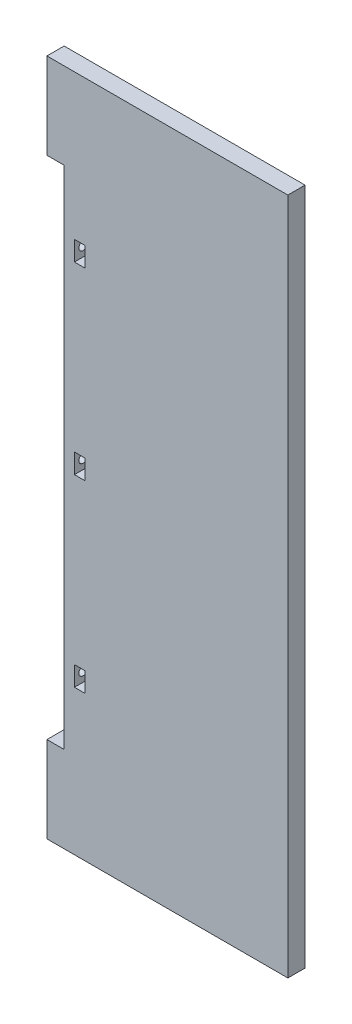
ISO-10303-21;
HEADER;
FILE_DESCRIPTION(('STEP AP214'),'2;1');
FILE_NAME('part.step','',(''),(''),'','','');
FILE_SCHEMA(('AUTOMOTIVE_DESIGN { 1 0 10303 214 1 1 1 1 }'));
ENDSEC;
DATA;
#1=APPLICATION_CONTEXT('core data for automotive mechanical design processes');
#2=APPLICATION_PROTOCOL_DEFINITION('international standard','automotive_design',2000,#1);
#3=PRODUCT_CONTEXT('',#1,'mechanical');
#4=PRODUCT('Part','Part','',(#3));
#5=PRODUCT_RELATED_PRODUCT_CATEGORY('part','',(#4));
#6=PRODUCT_DEFINITION_FORMATION('','',#4);
#7=PRODUCT_DEFINITION_CONTEXT('part definition',#1,'design');
#8=PRODUCT_DEFINITION('design','',#6,#7);
#9=PRODUCT_DEFINITION_SHAPE('','',#8);
#10=(LENGTH_UNIT() NAMED_UNIT(*) SI_UNIT(.MILLI.,.METRE.));
#11=(NAMED_UNIT(*) PLANE_ANGLE_UNIT() SI_UNIT($,.RADIAN.));
#12=(NAMED_UNIT(*) SI_UNIT($,.STERADIAN.) SOLID_ANGLE_UNIT());
#13=UNCERTAINTY_MEASURE_WITH_UNIT(LENGTH_MEASURE(1.E-05),#10,'distance_accuracy_value','');
#14=(GEOMETRIC_REPRESENTATION_CONTEXT(3) GLOBAL_UNCERTAINTY_ASSIGNED_CONTEXT((#13)) GLOBAL_UNIT_ASSIGNED_CONTEXT((#10,
#11,#12)) REPRESENTATION_CONTEXT('',''));
#15=CARTESIAN_POINT('',(0.,0.,0.));
#16=DIRECTION('',(0.,0.,1.));
#17=DIRECTION('',(1.,0.,0.));
#18=AXIS2_PLACEMENT_3D('',#15,#16,#17);
#19=CARTESIAN_POINT('',(-58.9999999999997,149.15,-0.50000000000026));
#20=DIRECTION('',(0.,-1.,0.));
#21=DIRECTION('',(1.,0.,0.));
#22=AXIS2_PLACEMENT_3D('',#19,#20,#21);
#23=PLANE('',#22);
#24=DIRECTION('',(1.,0.,0.));
#25=VECTOR('',#24,1.);
#26=CARTESIAN_POINT('',(-46.6231617647057,149.15,-5.50000000000026));
#27=LINE('',#26,#25);
#28=CARTESIAN_POINT('',(-61.9999999999998,149.15,-5.50000000000026));
#29=VERTEX_POINT('',#28);
#30=CARTESIAN_POINT('',(-58.9999999999997,149.15,-5.50000000000026));
#31=VERTEX_POINT('',#30);
#32=EDGE_CURVE('E157',#29,#31,#27,.T.);
#33=ORIENTED_EDGE('',*,*,#32,.F.);
#34=DIRECTION('',(0.,0.,-1.));
#35=VECTOR('',#34,1.);
#36=CARTESIAN_POINT('',(-61.9999999999998,149.15,-0.50000000000026));
#37=LINE('',#36,#35);
#38=CARTESIAN_POINT('',(-61.9999999999998,149.15,-0.50000000000026));
#39=VERTEX_POINT('',#38);
#40=EDGE_CURVE('E159',#39,#29,#37,.T.);
#41=ORIENTED_EDGE('',*,*,#40,.F.);
#42=DIRECTION('',(-1.,0.,0.));
#43=VECTOR('',#42,1.);
#44=CARTESIAN_POINT('',(-46.6231617647057,149.15,-0.50000000000026));
#45=LINE('',#44,#43);
#46=CARTESIAN_POINT('',(-58.9999999999997,149.15,-0.50000000000026));
#47=VERTEX_POINT('',#46);
#48=EDGE_CURVE('E189',#47,#39,#45,.T.);
#49=ORIENTED_EDGE('',*,*,#48,.F.);
#50=DIRECTION('',(0.,0.,-1.));
#51=VECTOR('',#50,1.);
#52=CARTESIAN_POINT('',(-58.9999999999997,149.15,-0.50000000000026));
#53=LINE('',#52,#51);
#54=EDGE_CURVE('E11',#47,#31,#53,.T.);
#55=ORIENTED_EDGE('',*,*,#54,.T.);
#56=EDGE_LOOP('',(#33,#41,#49,#55));
#57=FACE_BOUND('',#56,.T.);
#58=ADVANCED_FACE('F16',(#57),#23,.F.);
#59=CARTESIAN_POINT('',(-58.9999999999997,154.85,-0.50000000000026));
#60=DIRECTION('',(1.,0.,0.));
#61=DIRECTION('',(0.,1.,0.));
#62=AXIS2_PLACEMENT_3D('',#59,#60,#61);
#63=PLANE('',#62);
#64=DIRECTION('',(0.,1.,0.));
#65=VECTOR('',#64,1.);
#66=CARTESIAN_POINT('',(-58.9999999999997,126.675,-5.50000000000026));
#67=LINE('',#66,#65);
#68=CARTESIAN_POINT('',(-58.9999999999997,154.85,-5.50000000000026));
#69=VERTEX_POINT('',#68);
#70=EDGE_CURVE('E166',#31,#69,#67,.T.);
#71=ORIENTED_EDGE('',*,*,#70,.F.);
#72=ORIENTED_EDGE('',*,*,#54,.F.);
#73=DIRECTION('',(0.,-1.,0.));
#74=VECTOR('',#73,1.);
#75=CARTESIAN_POINT('',(-58.9999999999997,126.675,-0.50000000000026));
#76=LINE('',#75,#74);
#77=CARTESIAN_POINT('',(-58.9999999999997,154.85,-0.50000000000026));
#78=VERTEX_POINT('',#77);
#79=EDGE_CURVE('E573',#78,#47,#76,.T.);
#80=ORIENTED_EDGE('',*,*,#79,.F.);
#81=DIRECTION('',(0.,0.,-1.));
#82=VECTOR('',#81,1.);
#83=CARTESIAN_POINT('',(-58.9999999999997,154.85,-0.50000000000026));
#84=LINE('',#83,#82);
#85=EDGE_CURVE('E25',#78,#69,#84,.T.);
#86=ORIENTED_EDGE('',*,*,#85,.T.);
#87=EDGE_LOOP('',(#71,#72,#80,#86));
#88=FACE_BOUND('',#87,.T.);
#89=CARTESIAN_POINT('',(-58.9999999999997,152.,-3.00000000000026));
#90=DIRECTION('',(-1.,0.,0.));
#91=DIRECTION('',(0.,1.,0.));
#92=AXIS2_PLACEMENT_3D('',#89,#90,#91);
#93=CIRCLE('',#92,1.2295);
#94=CARTESIAN_POINT('',(-58.9999999999997,153.2295,-3.00000000000026));
#95=VERTEX_POINT('',#94);
#96=EDGE_CURVE('E221',#95,#95,#93,.T.);
#97=ORIENTED_EDGE('',*,*,#96,.F.);
#98=EDGE_LOOP('',(#97));
#99=FACE_BOUND('',#98,.T.);
#100=ADVANCED_FACE('F392',(#88,#99),#63,.F.);
#101=CARTESIAN_POINT('',(-61.9999999999998,154.85,-0.50000000000026));
#102=DIRECTION('',(0.,1.,0.));
#103=DIRECTION('',(-1.,0.,0.));
#104=AXIS2_PLACEMENT_3D('',#101,#102,#103);
#105=PLANE('',#104);
#106=DIRECTION('',(-1.,0.,0.));
#107=VECTOR('',#106,1.);
#108=CARTESIAN_POINT('',(-48.1231617647057,154.85,-5.50000000000026));
#109=LINE('',#108,#107);
#110=CARTESIAN_POINT('',(-61.9999999999998,154.85,-5.50000000000026));
#111=VERTEX_POINT('',#110);
#112=EDGE_CURVE('E180',#69,#111,#109,.T.);
#113=ORIENTED_EDGE('',*,*,#112,.F.);
#114=ORIENTED_EDGE('',*,*,#85,.F.);
#115=DIRECTION('',(1.,0.,0.));
#116=VECTOR('',#115,1.);
#117=CARTESIAN_POINT('',(-48.1231617647057,154.85,-0.50000000000026));
#118=LINE('',#117,#116);
#119=CARTESIAN_POINT('',(-61.9999999999998,154.85,-0.50000000000026));
#120=VERTEX_POINT('',#119);
#121=EDGE_CURVE('E351',#120,#78,#118,.T.);
#122=ORIENTED_EDGE('',*,*,#121,.F.);
#123=DIRECTION('',(0.,0.,-1.));
#124=VECTOR('',#123,1.);
#125=CARTESIAN_POINT('',(-61.9999999999998,154.85,-0.50000000000026));
#126=LINE('',#125,#124);
#127=EDGE_CURVE('E175',#120,#111,#126,.T.);
#128=ORIENTED_EDGE('',*,*,#127,.T.);
#129=EDGE_LOOP('',(#113,#114,#122,#128));
#130=FACE_BOUND('',#129,.T.);
#131=ADVANCED_FACE('F397',(#130),#105,.F.);
#132=CARTESIAN_POINT('',(-61.9999999999998,149.15,-0.50000000000026));
#133=DIRECTION('',(-1.,0.,0.));
#134=DIRECTION('',(0.,-1.,0.));
#135=AXIS2_PLACEMENT_3D('',#132,#133,#134);
#136=PLANE('',#135);
#137=DIRECTION('',(0.,-1.,0.));
#138=VECTOR('',#137,1.);
#139=CARTESIAN_POINT('',(-61.9999999999998,123.825,-5.50000000000026));
#140=LINE('',#139,#138);
#141=EDGE_CURVE('E165',#111,#29,#140,.T.);
#142=ORIENTED_EDGE('',*,*,#141,.F.);
#143=ORIENTED_EDGE('',*,*,#127,.F.);
#144=DIRECTION('',(0.,1.,0.));
#145=VECTOR('',#144,1.);
#146=CARTESIAN_POINT('',(-61.9999999999998,123.825,-0.50000000000026));
#147=LINE('',#146,#145);
#148=EDGE_CURVE('E174',#39,#120,#147,.T.);
#149=ORIENTED_EDGE('',*,*,#148,.F.);
#150=ORIENTED_EDGE('',*,*,#40,.T.);
#151=EDGE_LOOP('',(#142,#143,#149,#150));
#152=FACE_BOUND('',#151,.T.);
#153=CARTESIAN_POINT('',(-61.9999999999998,152.,-3.00000000000026));
#154=DIRECTION('',(1.,0.,0.));
#155=DIRECTION('',(0.,1.,0.));
#156=AXIS2_PLACEMENT_3D('',#153,#154,#155);
#157=CIRCLE('',#156,1.2295);
#158=CARTESIAN_POINT('',(-61.9999999999998,153.2295,-3.00000000000026));
#159=VERTEX_POINT('',#158);
#160=EDGE_CURVE('E191',#159,#159,#157,.T.);
#161=ORIENTED_EDGE('',*,*,#160,.F.);
#162=EDGE_LOOP('',(#161));
#163=FACE_BOUND('',#162,.T.);
#164=ADVANCED_FACE('F170',(#152,#163),#136,.F.);
#165=CARTESIAN_POINT('',(-58.9999999999997,42.15,-0.50000000000026));
#166=DIRECTION('',(0.,-1.,0.));
#167=DIRECTION('',(1.,0.,0.));
#168=AXIS2_PLACEMENT_3D('',#165,#166,#167);
#169=PLANE('',#168);
#170=DIRECTION('',(1.,0.,0.));
#171=VECTOR('',#170,1.);
#172=CARTESIAN_POINT('',(-46.6231617647057,42.15,-5.50000000000026));
#173=LINE('',#172,#171);
#174=CARTESIAN_POINT('',(-61.9999999999997,42.15,-5.50000000000026));
#175=VERTEX_POINT('',#174);
#176=CARTESIAN_POINT('',(-58.9999999999997,42.15,-5.50000000000026));
#177=VERTEX_POINT('',#176);
#178=EDGE_CURVE('E196',#175,#177,#173,.T.);
#179=ORIENTED_EDGE('',*,*,#178,.F.);
#180=DIRECTION('',(0.,0.,-1.));
#181=VECTOR('',#180,1.);
#182=CARTESIAN_POINT('',(-61.9999999999997,42.15,-0.50000000000026));
#183=LINE('',#182,#181);
#184=CARTESIAN_POINT('',(-61.9999999999997,42.15,-0.50000000000026));
#185=VERTEX_POINT('',#184);
#186=EDGE_CURVE('E200',#185,#175,#183,.T.);
#187=ORIENTED_EDGE('',*,*,#186,.F.);
#188=DIRECTION('',(-1.,0.,0.));
#189=VECTOR('',#188,1.);
#190=CARTESIAN_POINT('',(-46.6231617647057,42.15,-0.50000000000026));
#191=LINE('',#190,#189);
#192=CARTESIAN_POINT('',(-58.9999999999997,42.15,-0.50000000000026));
#193=VERTEX_POINT('',#192);
#194=EDGE_CURVE('E204',#193,#185,#191,.T.);
#195=ORIENTED_EDGE('',*,*,#194,.F.);
#196=DIRECTION('',(0.,0.,-1.));
#197=VECTOR('',#196,1.);
#198=CARTESIAN_POINT('',(-58.9999999999997,42.15,-0.50000000000026));
#199=LINE('',#198,#197);
#200=EDGE_CURVE('E176',#193,#177,#199,.T.);
#201=ORIENTED_EDGE('',*,*,#200,.T.);
#202=EDGE_LOOP('',(#179,#187,#195,#201));
#203=FACE_BOUND('',#202,.T.);
#204=ADVANCED_FACE('F406',(#203),#169,.F.);
#205=CARTESIAN_POINT('',(-61.9999999999997,42.15,-0.50000000000026));
#206=DIRECTION('',(-1.,0.,0.));
#207=DIRECTION('',(0.,-1.,0.));
#208=AXIS2_PLACEMENT_3D('',#205,#206,#207);
#209=PLANE('',#208);
#210=DIRECTION('',(0.,-1.,0.));
#211=VECTOR('',#210,1.);
#212=CARTESIAN_POINT('',(-61.9999999999997,70.325,-5.50000000000026));
#213=LINE('',#212,#211);
#214=CARTESIAN_POINT('',(-61.9999999999997,47.85,-5.50000000000026));
#215=VERTEX_POINT('',#214);
#216=EDGE_CURVE('E198',#215,#175,#213,.T.);
#217=ORIENTED_EDGE('',*,*,#216,.F.);
#218=DIRECTION('',(0.,0.,-1.));
#219=VECTOR('',#218,1.);
#220=CARTESIAN_POINT('',(-61.9999999999997,47.85,-0.50000000000026));
#221=LINE('',#220,#219);
#222=CARTESIAN_POINT('',(-61.9999999999997,47.85,-0.50000000000026));
#223=VERTEX_POINT('',#222);
#224=EDGE_CURVE('E212',#223,#215,#221,.T.);
#225=ORIENTED_EDGE('',*,*,#224,.F.);
#226=DIRECTION('',(0.,1.,0.));
#227=VECTOR('',#226,1.);
#228=CARTESIAN_POINT('',(-61.9999999999997,70.325,-0.50000000000026));
#229=LINE('',#228,#227);
#230=EDGE_CURVE('E206',#185,#223,#229,.T.);
#231=ORIENTED_EDGE('',*,*,#230,.F.);
#232=ORIENTED_EDGE('',*,*,#186,.T.);
#233=EDGE_LOOP('',(#217,#225,#231,#232));
#234=FACE_BOUND('',#233,.T.);
#235=CARTESIAN_POINT('',(-61.9999999999997,45.,-3.00000000000026));
#236=DIRECTION('',(1.,0.,0.));
#237=DIRECTION('',(0.,1.,0.));
#238=AXIS2_PLACEMENT_3D('',#235,#236,#237);
#239=CIRCLE('',#238,1.2295);
#240=CARTESIAN_POINT('',(-61.9999999999997,46.2295,-3.00000000000026));
#241=VERTEX_POINT('',#240);
#242=EDGE_CURVE('E218',#241,#241,#239,.T.);
#243=ORIENTED_EDGE('',*,*,#242,.F.);
#244=EDGE_LOOP('',(#243));
#245=FACE_BOUND('',#244,.T.);
#246=ADVANCED_FACE('F409',(#234,#245),#209,.F.);
#247=CARTESIAN_POINT('',(-58.9999999999997,47.85,-0.50000000000026));
#248=DIRECTION('',(1.,0.,0.));
#249=DIRECTION('',(0.,1.,0.));
#250=AXIS2_PLACEMENT_3D('',#247,#248,#249);
#251=PLANE('',#250);
#252=DIRECTION('',(0.,1.,0.));
#253=VECTOR('',#252,1.);
#254=CARTESIAN_POINT('',(-58.9999999999997,73.175,-5.50000000000026));
#255=LINE('',#254,#253);
#256=CARTESIAN_POINT('',(-58.9999999999997,47.85,-5.50000000000026));
#257=VERTEX_POINT('',#256);
#258=EDGE_CURVE('E223',#177,#257,#255,.T.);
#259=ORIENTED_EDGE('',*,*,#258,.F.);
#260=ORIENTED_EDGE('',*,*,#200,.F.);
#261=DIRECTION('',(0.,-1.,0.));
#262=VECTOR('',#261,1.);
#263=CARTESIAN_POINT('',(-58.9999999999997,73.175,-0.50000000000026));
#264=LINE('',#263,#262);
#265=CARTESIAN_POINT('',(-58.9999999999997,47.85,-0.50000000000026));
#266=VERTEX_POINT('',#265);
#267=EDGE_CURVE('E190',#266,#193,#264,.T.);
#268=ORIENTED_EDGE('',*,*,#267,.F.);
#269=DIRECTION('',(0.,0.,-1.));
#270=VECTOR('',#269,1.);
#271=CARTESIAN_POINT('',(-58.9999999999997,47.85,-0.50000000000026));
#272=LINE('',#271,#270);
#273=EDGE_CURVE('E203',#266,#257,#272,.T.);
#274=ORIENTED_EDGE('',*,*,#273,.T.);
#275=EDGE_LOOP('',(#259,#260,#268,#274));
#276=FACE_BOUND('',#275,.T.);
#277=CARTESIAN_POINT('',(-58.9999999999997,45.,-3.00000000000026));
#278=DIRECTION('',(-1.,0.,0.));
#279=DIRECTION('',(0.,1.,0.));
#280=AXIS2_PLACEMENT_3D('',#277,#278,#279);
#281=CIRCLE('',#280,1.2295);
#282=CARTESIAN_POINT('',(-58.9999999999997,46.2295,-3.00000000000026));
#283=VERTEX_POINT('',#282);
#284=EDGE_CURVE('E229',#283,#283,#281,.T.);
#285=ORIENTED_EDGE('',*,*,#284,.F.);
#286=EDGE_LOOP('',(#285));
#287=FACE_BOUND('',#286,.T.);
#288=ADVANCED_FACE('F413',(#276,#287),#251,.F.);
#289=CARTESIAN_POINT('',(-61.9999999999997,47.85,-0.50000000000026));
#290=DIRECTION('',(0.,1.,0.));
#291=DIRECTION('',(-1.,0.,0.));
#292=AXIS2_PLACEMENT_3D('',#289,#290,#291);
#293=PLANE('',#292);
#294=DIRECTION('',(-1.,0.,0.));
#295=VECTOR('',#294,1.);
#296=CARTESIAN_POINT('',(-48.1231617647057,47.85,-5.50000000000026));
#297=LINE('',#296,#295);
#298=EDGE_CURVE('E211',#257,#215,#297,.T.);
#299=ORIENTED_EDGE('',*,*,#298,.F.);
#300=ORIENTED_EDGE('',*,*,#273,.F.);
#301=DIRECTION('',(1.,0.,0.));
#302=VECTOR('',#301,1.);
#303=CARTESIAN_POINT('',(-48.1231617647057,47.85,-0.50000000000026));
#304=LINE('',#303,#302);
#305=EDGE_CURVE('E217',#223,#266,#304,.T.);
#306=ORIENTED_EDGE('',*,*,#305,.F.);
#307=ORIENTED_EDGE('',*,*,#224,.T.);
#308=EDGE_LOOP('',(#299,#300,#306,#307));
#309=FACE_BOUND('',#308,.T.);
#310=ADVANCED_FACE('F417',(#309),#293,.F.);
#311=CARTESIAN_POINT('',(-58.9999999999997,95.65,-0.50000000000026));
#312=DIRECTION('',(0.,-1.,0.));
#313=DIRECTION('',(1.,0.,0.));
#314=AXIS2_PLACEMENT_3D('',#311,#312,#313);
#315=PLANE('',#314);
#316=DIRECTION('',(1.,0.,0.));
#317=VECTOR('',#316,1.);
#318=CARTESIAN_POINT('',(-46.6231617647057,95.65,-5.50000000000026));
#319=LINE('',#318,#317);
#320=CARTESIAN_POINT('',(-61.9999999999997,95.65,-5.50000000000026));
#321=VERTEX_POINT('',#320);
#322=CARTESIAN_POINT('',(-58.9999999999997,95.65,-5.50000000000026));
#323=VERTEX_POINT('',#322);
#324=EDGE_CURVE('E239',#321,#323,#319,.T.);
#325=ORIENTED_EDGE('',*,*,#324,.F.);
#326=DIRECTION('',(0.,0.,-1.));
#327=VECTOR('',#326,1.);
#328=CARTESIAN_POINT('',(-61.9999999999997,95.65,-0.50000000000026));
#329=LINE('',#328,#327);
#330=CARTESIAN_POINT('',(-61.9999999999997,95.65,-0.50000000000026));
#331=VERTEX_POINT('',#330);
#332=EDGE_CURVE('E243',#331,#321,#329,.T.);
#333=ORIENTED_EDGE('',*,*,#332,.F.);
#334=DIRECTION('',(-1.,0.,0.));
#335=VECTOR('',#334,1.);
#336=CARTESIAN_POINT('',(-46.6231617647057,95.65,-0.50000000000026));
#337=LINE('',#336,#335);
#338=CARTESIAN_POINT('',(-58.9999999999997,95.65,-0.50000000000026));
#339=VERTEX_POINT('',#338);
#340=EDGE_CURVE('E247',#339,#331,#337,.T.);
#341=ORIENTED_EDGE('',*,*,#340,.F.);
#342=DIRECTION('',(0.,0.,-1.));
#343=VECTOR('',#342,1.);
#344=CARTESIAN_POINT('',(-58.9999999999997,95.65,-0.50000000000026));
#345=LINE('',#344,#343);
#346=EDGE_CURVE('E215',#339,#323,#345,.T.);
#347=ORIENTED_EDGE('',*,*,#346,.T.);
#348=EDGE_LOOP('',(#325,#333,#341,#347));
#349=FACE_BOUND('',#348,.T.);
#350=ADVANCED_FACE('F421',(#349),#315,.F.);
#351=CARTESIAN_POINT('',(-58.9999999999997,101.35,-0.50000000000026));
#352=DIRECTION('',(1.,0.,0.));
#353=DIRECTION('',(0.,1.,0.));
#354=AXIS2_PLACEMENT_3D('',#351,#352,#353);
#355=PLANE('',#354);
#356=DIRECTION('',(0.,1.,0.));
#357=VECTOR('',#356,1.);
#358=CARTESIAN_POINT('',(-58.9999999999997,99.925,-5.50000000000026));
#359=LINE('',#358,#357);
#360=CARTESIAN_POINT('',(-58.9999999999997,101.35,-5.50000000000026));
#361=VERTEX_POINT('',#360);
#362=EDGE_CURVE('E242',#323,#361,#359,.T.);
#363=ORIENTED_EDGE('',*,*,#362,.F.);
#364=ORIENTED_EDGE('',*,*,#346,.F.);
#365=DIRECTION('',(0.,-1.,0.));
#366=VECTOR('',#365,1.);
#367=CARTESIAN_POINT('',(-58.9999999999997,99.925,-0.50000000000026));
#368=LINE('',#367,#366);
#369=CARTESIAN_POINT('',(-58.9999999999997,101.35,-0.50000000000026));
#370=VERTEX_POINT('',#369);
#371=EDGE_CURVE('E249',#370,#339,#368,.T.);
#372=ORIENTED_EDGE('',*,*,#371,.F.);
#373=DIRECTION('',(0.,0.,-1.));
#374=VECTOR('',#373,1.);
#375=CARTESIAN_POINT('',(-58.9999999999997,101.35,-0.50000000000026));
#376=LINE('',#375,#374);
#377=EDGE_CURVE('E253',#370,#361,#376,.T.);
#378=ORIENTED_EDGE('',*,*,#377,.T.);
#379=EDGE_LOOP('',(#363,#364,#372,#378));
#380=FACE_BOUND('',#379,.T.);
#381=CARTESIAN_POINT('',(-58.9999999999997,98.5,-3.00000000000026));
#382=DIRECTION('',(-1.,0.,0.));
#383=DIRECTION('',(0.,1.,0.));
#384=AXIS2_PLACEMENT_3D('',#381,#382,#383);
#385=CIRCLE('',#384,1.2295);
#386=CARTESIAN_POINT('',(-58.9999999999997,99.7295,-3.00000000000026));
#387=VERTEX_POINT('',#386);
#388=EDGE_CURVE('E222',#387,#387,#385,.T.);
#389=ORIENTED_EDGE('',*,*,#388,.F.);
#390=EDGE_LOOP('',(#389));
#391=FACE_BOUND('',#390,.T.);
#392=ADVANCED_FACE('F425',(#380,#391),#355,.F.);
#393=CARTESIAN_POINT('',(-61.9999999999997,101.35,-0.50000000000026));
#394=DIRECTION('',(0.,1.,0.));
#395=DIRECTION('',(-1.,0.,0.));
#396=AXIS2_PLACEMENT_3D('',#393,#394,#395);
#397=PLANE('',#396);
#398=DIRECTION('',(-1.,0.,0.));
#399=VECTOR('',#398,1.);
#400=CARTESIAN_POINT('',(-48.1231617647057,101.35,-5.50000000000026));
#401=LINE('',#400,#399);
#402=CARTESIAN_POINT('',(-61.9999999999997,101.35,-5.50000000000026));
#403=VERTEX_POINT('',#402);
#404=EDGE_CURVE('E199',#361,#403,#401,.T.);
#405=ORIENTED_EDGE('',*,*,#404,.F.);
#406=ORIENTED_EDGE('',*,*,#377,.F.);
#407=DIRECTION('',(1.,0.,0.));
#408=VECTOR('',#407,1.);
#409=CARTESIAN_POINT('',(-48.1231617647057,101.35,-0.50000000000026));
#410=LINE('',#409,#408);
#411=CARTESIAN_POINT('',(-61.9999999999997,101.35,-0.50000000000026));
#412=VERTEX_POINT('',#411);
#413=EDGE_CURVE('E238',#412,#370,#410,.T.);
#414=ORIENTED_EDGE('',*,*,#413,.F.);
#415=DIRECTION('',(0.,0.,-1.));
#416=VECTOR('',#415,1.);
#417=CARTESIAN_POINT('',(-61.9999999999997,101.35,-0.50000000000026));
#418=LINE('',#417,#416);
#419=EDGE_CURVE('E246',#412,#403,#418,.T.);
#420=ORIENTED_EDGE('',*,*,#419,.T.);
#421=EDGE_LOOP('',(#405,#406,#414,#420));
#422=FACE_BOUND('',#421,.T.);
#423=ADVANCED_FACE('F429',(#422),#397,.F.);
#424=CARTESIAN_POINT('',(-61.9999999999997,95.65,-0.50000000000026));
#425=DIRECTION('',(-1.,0.,0.));
#426=DIRECTION('',(0.,-1.,0.));
#427=AXIS2_PLACEMENT_3D('',#424,#425,#426);
#428=PLANE('',#427);
#429=DIRECTION('',(0.,-1.,0.));
#430=VECTOR('',#429,1.);
#431=CARTESIAN_POINT('',(-61.9999999999997,97.075,-5.50000000000026));
#432=LINE('',#431,#430);
#433=EDGE_CURVE('E241',#403,#321,#432,.T.);
#434=ORIENTED_EDGE('',*,*,#433,.F.);
#435=ORIENTED_EDGE('',*,*,#419,.F.);
#436=DIRECTION('',(0.,1.,0.));
#437=VECTOR('',#436,1.);
#438=CARTESIAN_POINT('',(-61.9999999999997,97.075,-0.50000000000026));
#439=LINE('',#438,#437);
#440=EDGE_CURVE('E250',#331,#412,#439,.T.);
#441=ORIENTED_EDGE('',*,*,#440,.F.);
#442=ORIENTED_EDGE('',*,*,#332,.T.);
#443=EDGE_LOOP('',(#434,#435,#441,#442));
#444=FACE_BOUND('',#443,.T.);
#445=CARTESIAN_POINT('',(-61.9999999999997,98.5,-3.00000000000026));
#446=DIRECTION('',(1.,0.,0.));
#447=DIRECTION('',(0.,1.,0.));
#448=AXIS2_PLACEMENT_3D('',#445,#446,#447);
#449=CIRCLE('',#448,1.2295);
#450=CARTESIAN_POINT('',(-61.9999999999997,99.7295,-3.00000000000026));
#451=VERTEX_POINT('',#450);
#452=EDGE_CURVE('E270',#451,#451,#449,.T.);
#453=ORIENTED_EDGE('',*,*,#452,.F.);
#454=EDGE_LOOP('',(#453));
#455=FACE_BOUND('',#454,.T.);
#456=ADVANCED_FACE('F433',(#444,#455),#428,.F.);
#457=CARTESIAN_POINT('',(-60.5999999999998,152.,-3.00000000000026));
#458=DIRECTION('',(-1.,0.,0.));
#459=DIRECTION('',(0.,1.,0.));
#460=AXIS2_PLACEMENT_3D('',#457,#458,#459);
#461=CYLINDRICAL_SURFACE('',#460,1.2295);
#462=CARTESIAN_POINT('',(-56.1999999999998,152.,-3.00000000000026));
#463=DIRECTION('',(-1.,0.,0.));
#464=DIRECTION('',(0.,1.,0.));
#465=AXIS2_PLACEMENT_3D('',#462,#463,#464);
#466=CIRCLE('',#465,1.2295);
#467=CARTESIAN_POINT('',(-56.1999999999998,153.2295,-3.00000000000026));
#468=VERTEX_POINT('',#467);
#469=EDGE_CURVE('E194',#468,#468,#466,.T.);
#470=ORIENTED_EDGE('',*,*,#469,.F.);
#471=EDGE_LOOP('',(#470));
#472=FACE_BOUND('',#471,.T.);
#473=ORIENTED_EDGE('',*,*,#96,.T.);
#474=EDGE_LOOP('',(#473));
#475=FACE_BOUND('',#474,.T.);
#476=ADVANCED_FACE('F437',(#472,#475),#461,.F.);
#477=CARTESIAN_POINT('',(-60.5999999999997,45.,-3.00000000000026));
#478=DIRECTION('',(-1.,0.,0.));
#479=DIRECTION('',(0.,1.,0.));
#480=AXIS2_PLACEMENT_3D('',#477,#478,#479);
#481=CYLINDRICAL_SURFACE('',#480,1.2295);
#482=CARTESIAN_POINT('',(-64.9999999999997,45.,-3.00000000000026));
#483=DIRECTION('',(1.,0.,0.));
#484=DIRECTION('',(0.,1.,0.));
#485=AXIS2_PLACEMENT_3D('',#482,#483,#484);
#486=CIRCLE('',#485,1.2295);
#487=CARTESIAN_POINT('',(-64.9999999999997,46.2295,-3.00000000000026));
#488=VERTEX_POINT('',#487);
#489=EDGE_CURVE('E275',#488,#488,#486,.T.);
#490=ORIENTED_EDGE('',*,*,#489,.F.);
#491=EDGE_LOOP('',(#490));
#492=FACE_BOUND('',#491,.T.);
#493=ORIENTED_EDGE('',*,*,#242,.T.);
#494=EDGE_LOOP('',(#493));
#495=FACE_BOUND('',#494,.T.);
#496=ADVANCED_FACE('F441',(#492,#495),#481,.F.);
#497=CARTESIAN_POINT('',(-60.5999999999997,98.5,-3.00000000000026));
#498=DIRECTION('',(-1.,0.,0.));
#499=DIRECTION('',(0.,1.,0.));
#500=AXIS2_PLACEMENT_3D('',#497,#498,#499);
#501=CYLINDRICAL_SURFACE('',#500,1.2295);
#502=CARTESIAN_POINT('',(-56.1999999999997,98.5,-3.00000000000026));
#503=DIRECTION('',(-1.,0.,0.));
#504=DIRECTION('',(0.,1.,0.));
#505=AXIS2_PLACEMENT_3D('',#502,#503,#504);
#506=CIRCLE('',#505,1.2295);
#507=CARTESIAN_POINT('',(-56.1999999999997,99.7295,-3.00000000000026));
#508=VERTEX_POINT('',#507);
#509=EDGE_CURVE('E195',#508,#508,#506,.T.);
#510=ORIENTED_EDGE('',*,*,#509,.F.);
#511=EDGE_LOOP('',(#510));
#512=FACE_BOUND('',#511,.T.);
#513=ORIENTED_EDGE('',*,*,#388,.T.);
#514=EDGE_LOOP('',(#513));
#515=FACE_BOUND('',#514,.T.);
#516=ADVANCED_FACE('F445',(#512,#515),#501,.F.);
#517=CARTESIAN_POINT('',(-55.8306209344526,152.,-3.00000000000026));
#518=DIRECTION('',(-1.,0.,0.));
#519=DIRECTION('',(0.,1.,0.));
#520=AXIS2_PLACEMENT_3D('',#517,#518,#519);
#521=CONICAL_SURFACE('',#520,0.61475,1.02974425867665);
#522=CARTESIAN_POINT('',(-55.4612418689054,152.,-3.00000000000026));
#523=VERTEX_POINT('',#522);
#524=VERTEX_LOOP('',#523);
#525=FACE_BOUND('',#524,.T.);
#526=ORIENTED_EDGE('',*,*,#469,.T.);
#527=EDGE_LOOP('',(#526));
#528=FACE_BOUND('',#527,.T.);
#529=ADVANCED_FACE('F449',(#525,#528),#521,.F.);
#530=CARTESIAN_POINT('',(-60.5999999999998,152.,-3.00000000000026));
#531=DIRECTION('',(-1.,0.,0.));
#532=DIRECTION('',(0.,1.,0.));
#533=AXIS2_PLACEMENT_3D('',#530,#531,#532);
#534=CYLINDRICAL_SURFACE('',#533,1.2295);
#535=ORIENTED_EDGE('',*,*,#160,.T.);
#536=EDGE_LOOP('',(#535));
#537=FACE_BOUND('',#536,.T.);
#538=CARTESIAN_POINT('',(-64.9999999999998,152.,-3.00000000000026));
#539=DIRECTION('',(1.,0.,0.));
#540=DIRECTION('',(0.,1.,0.));
#541=AXIS2_PLACEMENT_3D('',#538,#539,#540);
#542=CIRCLE('',#541,1.2295);
#543=CARTESIAN_POINT('',(-64.9999999999998,153.2295,-3.00000000000026));
#544=VERTEX_POINT('',#543);
#545=EDGE_CURVE('E282',#544,#544,#542,.T.);
#546=ORIENTED_EDGE('',*,*,#545,.F.);
#547=EDGE_LOOP('',(#546));
#548=FACE_BOUND('',#547,.T.);
#549=ADVANCED_FACE('F453',(#537,#548),#534,.F.);
#550=CARTESIAN_POINT('',(-55.8306209344525,98.5,-3.00000000000026));
#551=DIRECTION('',(-1.,0.,0.));
#552=DIRECTION('',(0.,1.,0.));
#553=AXIS2_PLACEMENT_3D('',#550,#551,#552);
#554=CONICAL_SURFACE('',#553,0.61475,1.02974425867665);
#555=CARTESIAN_POINT('',(-55.4612418689053,98.5,-3.00000000000026));
#556=VERTEX_POINT('',#555);
#557=VERTEX_LOOP('',#556);
#558=FACE_BOUND('',#557,.T.);
#559=ORIENTED_EDGE('',*,*,#509,.T.);
#560=EDGE_LOOP('',(#559));
#561=FACE_BOUND('',#560,.T.);
#562=ADVANCED_FACE('F457',(#558,#561),#554,.F.);
#563=CARTESIAN_POINT('',(-60.5999999999997,98.5,-3.00000000000026));
#564=DIRECTION('',(-1.,0.,0.));
#565=DIRECTION('',(0.,1.,0.));
#566=AXIS2_PLACEMENT_3D('',#563,#564,#565);
#567=CYLINDRICAL_SURFACE('',#566,1.2295);
#568=ORIENTED_EDGE('',*,*,#452,.T.);
#569=EDGE_LOOP('',(#568));
#570=FACE_BOUND('',#569,.T.);
#571=CARTESIAN_POINT('',(-64.9999999999997,98.5,-3.00000000000026));
#572=DIRECTION('',(1.,0.,0.));
#573=DIRECTION('',(0.,1.,0.));
#574=AXIS2_PLACEMENT_3D('',#571,#572,#573);
#575=CIRCLE('',#574,1.2295);
#576=CARTESIAN_POINT('',(-64.9999999999997,99.7295,-3.00000000000026));
#577=VERTEX_POINT('',#576);
#578=EDGE_CURVE('E278',#577,#577,#575,.T.);
#579=ORIENTED_EDGE('',*,*,#578,.F.);
#580=EDGE_LOOP('',(#579));
#581=FACE_BOUND('',#580,.T.);
#582=ADVANCED_FACE('F461',(#570,#581),#567,.F.);
#583=CARTESIAN_POINT('',(-55.8306209344525,45.,-3.00000000000026));
#584=DIRECTION('',(-1.,0.,0.));
#585=DIRECTION('',(0.,1.,0.));
#586=AXIS2_PLACEMENT_3D('',#583,#584,#585);
#587=CONICAL_SURFACE('',#586,0.61475,1.02974425867665);
#588=CARTESIAN_POINT('',(-55.4612418689053,45.,-3.00000000000026));
#589=VERTEX_POINT('',#588);
#590=VERTEX_LOOP('',#589);
#591=FACE_BOUND('',#590,.T.);
#592=CARTESIAN_POINT('',(-56.1999999999997,45.,-3.00000000000026));
#593=DIRECTION('',(-1.,0.,0.));
#594=DIRECTION('',(0.,1.,0.));
#595=AXIS2_PLACEMENT_3D('',#592,#593,#594);
#596=CIRCLE('',#595,1.2295);
#597=CARTESIAN_POINT('',(-56.1999999999997,46.2295,-3.00000000000026));
#598=VERTEX_POINT('',#597);
#599=EDGE_CURVE('E232',#598,#598,#596,.T.);
#600=ORIENTED_EDGE('',*,*,#599,.T.);
#601=EDGE_LOOP('',(#600));
#602=FACE_BOUND('',#601,.T.);
#603=ADVANCED_FACE('F464',(#591,#602),#587,.F.);
#604=CARTESIAN_POINT('',(-60.5999999999997,45.,-3.00000000000026));
#605=DIRECTION('',(-1.,0.,0.));
#606=DIRECTION('',(0.,1.,0.));
#607=AXIS2_PLACEMENT_3D('',#604,#605,#606);
#608=CYLINDRICAL_SURFACE('',#607,1.2295);
#609=ORIENTED_EDGE('',*,*,#284,.T.);
#610=EDGE_LOOP('',(#609));
#611=FACE_BOUND('',#610,.T.);
#612=ORIENTED_EDGE('',*,*,#599,.F.);
#613=EDGE_LOOP('',(#612));
#614=FACE_BOUND('',#613,.T.);
#615=ADVANCED_FACE('F468',(#611,#614),#608,.F.);
#616=CARTESIAN_POINT('',(-69.9999999999999,0.,-5.50000000000026));
#617=DIRECTION('',(0.,-1.,0.));
#618=DIRECTION('',(1.,0.,0.));
#619=AXIS2_PLACEMENT_3D('',#616,#617,#618);
#620=PLANE('',#619);
#621=DIRECTION('',(1.,0.,0.));
#622=VECTOR('',#621,1.);
#623=CARTESIAN_POINT('',(-69.9999999999999,0.,-5.50000000000026));
#624=LINE('',#623,#622);
#625=CARTESIAN_POINT('',(-69.9999999999999,0.,-5.50000000000026));
#626=VERTEX_POINT('',#625);
#627=CARTESIAN_POINT('',(0.,0.,-5.50000000000026));
#628=VERTEX_POINT('',#627);
#629=EDGE_CURVE('E233',#626,#628,#624,.T.);
#630=ORIENTED_EDGE('',*,*,#629,.T.);
#631=DIRECTION('',(0.,0.,1.));
#632=VECTOR('',#631,1.);
#633=CARTESIAN_POINT('',(0.,0.,-5.50000000000026));
#634=LINE('',#633,#632);
#635=CARTESIAN_POINT('',(0.,0.,-0.50000000000026));
#636=VERTEX_POINT('',#635);
#637=EDGE_CURVE('E292',#628,#636,#634,.T.);
#638=ORIENTED_EDGE('',*,*,#637,.T.);
#639=DIRECTION('',(1.,0.,0.));
#640=VECTOR('',#639,1.);
#641=CARTESIAN_POINT('',(-69.9999999999999,0.,-0.50000000000026));
#642=LINE('',#641,#640);
#643=CARTESIAN_POINT('',(-69.9999999999999,0.,-0.50000000000026));
#644=VERTEX_POINT('',#643);
#645=EDGE_CURVE('E183',#644,#636,#642,.T.);
#646=ORIENTED_EDGE('',*,*,#645,.F.);
#647=DIRECTION('',(0.,0.,1.));
#648=VECTOR('',#647,1.);
#649=CARTESIAN_POINT('',(-69.9999999999999,0.,-5.50000000000026));
#650=LINE('',#649,#648);
#651=EDGE_CURVE('E298',#626,#644,#650,.T.);
#652=ORIENTED_EDGE('',*,*,#651,.F.);
#653=EDGE_LOOP('',(#630,#638,#646,#652));
#654=FACE_BOUND('',#653,.T.);
#655=ADVANCED_FACE('F369',(#654),#620,.T.);
#656=CARTESIAN_POINT('',(-69.9999999999999,24.9999999999999,-5.50000000000026));
#657=DIRECTION('',(-1.,0.,0.));
#658=DIRECTION('',(0.,-1.,0.));
#659=AXIS2_PLACEMENT_3D('',#656,#657,#658);
#660=PLANE('',#659);
#661=DIRECTION('',(0.,-1.,0.));
#662=VECTOR('',#661,1.);
#663=CARTESIAN_POINT('',(-69.9999999999999,24.9999999999999,-5.50000000000026));
#664=LINE('',#663,#662);
#665=CARTESIAN_POINT('',(-69.9999999999999,25.,-5.50000000000026));
#666=VERTEX_POINT('',#665);
#667=EDGE_CURVE('E295',#666,#626,#664,.T.);
#668=ORIENTED_EDGE('',*,*,#667,.T.);
#669=ORIENTED_EDGE('',*,*,#651,.T.);
#670=DIRECTION('',(0.,-1.,0.));
#671=VECTOR('',#670,1.);
#672=CARTESIAN_POINT('',(-69.9999999999999,24.9999999999999,-0.50000000000026));
#673=LINE('',#672,#671);
#674=CARTESIAN_POINT('',(-69.9999999999999,25.,-0.50000000000026));
#675=VERTEX_POINT('',#674);
#676=EDGE_CURVE('E297',#675,#644,#673,.T.);
#677=ORIENTED_EDGE('',*,*,#676,.F.);
#678=DIRECTION('',(0.,0.,1.));
#679=VECTOR('',#678,1.);
#680=CARTESIAN_POINT('',(-69.9999999999999,25.,-5.50000000000026));
#681=LINE('',#680,#679);
#682=EDGE_CURVE('E285',#666,#675,#681,.T.);
#683=ORIENTED_EDGE('',*,*,#682,.F.);
#684=EDGE_LOOP('',(#668,#669,#677,#683));
#685=FACE_BOUND('',#684,.T.);
#686=ADVANCED_FACE('F371',(#685),#660,.T.);
#687=CARTESIAN_POINT('',(-64.9999999999997,25.,-5.50000000000026));
#688=DIRECTION('',(0.,1.,0.));
#689=DIRECTION('',(-1.,0.,0.));
#690=AXIS2_PLACEMENT_3D('',#687,#688,#689);
#691=PLANE('',#690);
#692=DIRECTION('',(-1.,0.,0.));
#693=VECTOR('',#692,1.);
#694=CARTESIAN_POINT('',(-64.9999999999997,25.,-5.50000000000026));
#695=LINE('',#694,#693);
#696=CARTESIAN_POINT('',(-64.9999999999997,25.,-5.50000000000026));
#697=VERTEX_POINT('',#696);
#698=EDGE_CURVE('E301',#697,#666,#695,.T.);
#699=ORIENTED_EDGE('',*,*,#698,.T.);
#700=ORIENTED_EDGE('',*,*,#682,.T.);
#701=DIRECTION('',(-1.,0.,0.));
#702=VECTOR('',#701,1.);
#703=CARTESIAN_POINT('',(-64.9999999999997,25.,-0.50000000000026));
#704=LINE('',#703,#702);
#705=CARTESIAN_POINT('',(-64.9999999999997,25.,-0.50000000000026));
#706=VERTEX_POINT('',#705);
#707=EDGE_CURVE('E306',#706,#675,#704,.T.);
#708=ORIENTED_EDGE('',*,*,#707,.F.);
#709=DIRECTION('',(0.,0.,1.));
#710=VECTOR('',#709,1.);
#711=CARTESIAN_POINT('',(-64.9999999999997,25.,-5.50000000000026));
#712=LINE('',#711,#710);
#713=EDGE_CURVE('E314',#697,#706,#712,.T.);
#714=ORIENTED_EDGE('',*,*,#713,.F.);
#715=EDGE_LOOP('',(#699,#700,#708,#714));
#716=FACE_BOUND('',#715,.T.);
#717=ADVANCED_FACE('F375',(#716),#691,.T.);
#718=CARTESIAN_POINT('',(-64.9999999999998,172.,-5.50000000000026));
#719=DIRECTION('',(-1.,0.,0.));
#720=DIRECTION('',(0.,-1.,0.));
#721=AXIS2_PLACEMENT_3D('',#718,#719,#720);
#722=PLANE('',#721);
#723=ORIENTED_EDGE('',*,*,#545,.T.);
#724=EDGE_LOOP('',(#723));
#725=FACE_BOUND('',#724,.T.);
#726=ORIENTED_EDGE('',*,*,#578,.T.);
#727=EDGE_LOOP('',(#726));
#728=FACE_BOUND('',#727,.T.);
#729=ORIENTED_EDGE('',*,*,#489,.T.);
#730=EDGE_LOOP('',(#729));
#731=FACE_BOUND('',#730,.T.);
#732=DIRECTION('',(0.,-1.,0.));
#733=VECTOR('',#732,1.);
#734=CARTESIAN_POINT('',(-64.9999999999998,172.,-5.50000000000026));
#735=LINE('',#734,#733);
#736=CARTESIAN_POINT('',(-64.9999999999998,172.,-5.50000000000026));
#737=VERTEX_POINT('',#736);
#738=EDGE_CURVE('E279',#737,#697,#735,.T.);
#739=ORIENTED_EDGE('',*,*,#738,.T.);
#740=ORIENTED_EDGE('',*,*,#713,.T.);
#741=DIRECTION('',(0.,-1.,0.));
#742=VECTOR('',#741,1.);
#743=CARTESIAN_POINT('',(-64.9999999999998,172.,-0.50000000000026));
#744=LINE('',#743,#742);
#745=CARTESIAN_POINT('',(-64.9999999999998,172.,-0.50000000000026));
#746=VERTEX_POINT('',#745);
#747=EDGE_CURVE('E313',#746,#706,#744,.T.);
#748=ORIENTED_EDGE('',*,*,#747,.F.);
#749=DIRECTION('',(0.,0.,1.));
#750=VECTOR('',#749,1.);
#751=CARTESIAN_POINT('',(-64.9999999999998,172.,-5.50000000000026));
#752=LINE('',#751,#750);
#753=EDGE_CURVE('E323',#737,#746,#752,.T.);
#754=ORIENTED_EDGE('',*,*,#753,.F.);
#755=EDGE_LOOP('',(#739,#740,#748,#754));
#756=FACE_BOUND('',#755,.T.);
#757=ADVANCED_FACE('F377',(#725,#728,#731,#756),#722,.T.);
#758=CARTESIAN_POINT('',(-70.,172.,-5.50000000000026));
#759=DIRECTION('',(0.,-1.,0.));
#760=DIRECTION('',(0.,0.,-1.));
#761=AXIS2_PLACEMENT_3D('',#758,#759,#760);
#762=PLANE('',#761);
#763=DIRECTION('',(1.,0.,0.));
#764=VECTOR('',#763,1.);
#765=CARTESIAN_POINT('',(-70.,172.,-5.50000000000026));
#766=LINE('',#765,#764);
#767=CARTESIAN_POINT('',(-70.,172.,-5.50000000000026));
#768=VERTEX_POINT('',#767);
#769=EDGE_CURVE('E317',#768,#737,#766,.T.);
#770=ORIENTED_EDGE('',*,*,#769,.T.);
#771=ORIENTED_EDGE('',*,*,#753,.T.);
#772=DIRECTION('',(1.,0.,0.));
#773=VECTOR('',#772,1.);
#774=CARTESIAN_POINT('',(-70.,172.,-0.50000000000026));
#775=LINE('',#774,#773);
#776=CARTESIAN_POINT('',(-70.,172.,-0.50000000000026));
#777=VERTEX_POINT('',#776);
#778=EDGE_CURVE('E322',#777,#746,#775,.T.);
#779=ORIENTED_EDGE('',*,*,#778,.F.);
#780=DIRECTION('',(0.,0.,1.));
#781=VECTOR('',#780,1.);
#782=CARTESIAN_POINT('',(-70.,172.,-5.50000000000026));
#783=LINE('',#782,#781);
#784=EDGE_CURVE('E332',#768,#777,#783,.T.);
#785=ORIENTED_EDGE('',*,*,#784,.F.);
#786=EDGE_LOOP('',(#770,#771,#779,#785));
#787=FACE_BOUND('',#786,.T.);
#788=ADVANCED_FACE('F379',(#787),#762,.T.);
#789=CARTESIAN_POINT('',(-70.,197.,-5.50000000000026));
#790=DIRECTION('',(-1.,0.,0.));
#791=DIRECTION('',(0.,-1.,0.));
#792=AXIS2_PLACEMENT_3D('',#789,#790,#791);
#793=PLANE('',#792);
#794=DIRECTION('',(0.,-1.,0.));
#795=VECTOR('',#794,1.);
#796=CARTESIAN_POINT('',(-70.,197.,-5.50000000000026));
#797=LINE('',#796,#795);
#798=CARTESIAN_POINT('',(-70.,197.,-5.50000000000026));
#799=VERTEX_POINT('',#798);
#800=EDGE_CURVE('E326',#799,#768,#797,.T.);
#801=ORIENTED_EDGE('',*,*,#800,.T.);
#802=ORIENTED_EDGE('',*,*,#784,.T.);
#803=DIRECTION('',(0.,-1.,0.));
#804=VECTOR('',#803,1.);
#805=CARTESIAN_POINT('',(-70.,197.,-0.50000000000026));
#806=LINE('',#805,#804);
#807=CARTESIAN_POINT('',(-70.,197.,-0.50000000000026));
#808=VERTEX_POINT('',#807);
#809=EDGE_CURVE('E331',#808,#777,#806,.T.);
#810=ORIENTED_EDGE('',*,*,#809,.F.);
#811=DIRECTION('',(0.,0.,1.));
#812=VECTOR('',#811,1.);
#813=CARTESIAN_POINT('',(-70.,197.,-5.50000000000026));
#814=LINE('',#813,#812);
#815=EDGE_CURVE('E341',#799,#808,#814,.T.);
#816=ORIENTED_EDGE('',*,*,#815,.F.);
#817=EDGE_LOOP('',(#801,#802,#810,#816));
#818=FACE_BOUND('',#817,.T.);
#819=ADVANCED_FACE('F381',(#818),#793,.T.);
#820=CARTESIAN_POINT('',(0.,197.,-5.50000000000026));
#821=DIRECTION('',(0.,1.,0.));
#822=DIRECTION('',(-1.,0.,0.));
#823=AXIS2_PLACEMENT_3D('',#820,#821,#822);
#824=PLANE('',#823);
#825=DIRECTION('',(-1.,0.,0.));
#826=VECTOR('',#825,1.);
#827=CARTESIAN_POINT('',(0.,197.,-5.50000000000026));
#828=LINE('',#827,#826);
#829=CARTESIAN_POINT('',(0.,197.,-5.50000000000026));
#830=VERTEX_POINT('',#829);
#831=EDGE_CURVE('E335',#830,#799,#828,.T.);
#832=ORIENTED_EDGE('',*,*,#831,.T.);
#833=ORIENTED_EDGE('',*,*,#815,.T.);
#834=DIRECTION('',(-1.,0.,0.));
#835=VECTOR('',#834,1.);
#836=CARTESIAN_POINT('',(0.,197.,-0.50000000000026));
#837=LINE('',#836,#835);
#838=CARTESIAN_POINT('',(0.,197.,-0.50000000000026));
#839=VERTEX_POINT('',#838);
#840=EDGE_CURVE('E340',#839,#808,#837,.T.);
#841=ORIENTED_EDGE('',*,*,#840,.F.);
#842=DIRECTION('',(0.,0.,1.));
#843=VECTOR('',#842,1.);
#844=CARTESIAN_POINT('',(0.,197.,-5.50000000000026));
#845=LINE('',#844,#843);
#846=EDGE_CURVE('E349',#830,#839,#845,.T.);
#847=ORIENTED_EDGE('',*,*,#846,.F.);
#848=EDGE_LOOP('',(#832,#833,#841,#847));
#849=FACE_BOUND('',#848,.T.);
#850=ADVANCED_FACE('F365',(#849),#824,.T.);
#851=CARTESIAN_POINT('',(0.,0.,-5.50000000000026));
#852=DIRECTION('',(1.,0.,0.));
#853=DIRECTION('',(0.,1.,0.));
#854=AXIS2_PLACEMENT_3D('',#851,#852,#853);
#855=PLANE('',#854);
#856=DIRECTION('',(0.,1.,0.));
#857=VECTOR('',#856,1.);
#858=CARTESIAN_POINT('',(0.,0.,-5.50000000000026));
#859=LINE('',#858,#857);
#860=EDGE_CURVE('E344',#628,#830,#859,.T.);
#861=ORIENTED_EDGE('',*,*,#860,.T.);
#862=ORIENTED_EDGE('',*,*,#846,.T.);
#863=DIRECTION('',(0.,1.,0.));
#864=VECTOR('',#863,1.);
#865=CARTESIAN_POINT('',(0.,0.,-0.50000000000026));
#866=LINE('',#865,#864);
#867=EDGE_CURVE('E20',#636,#839,#866,.T.);
#868=ORIENTED_EDGE('',*,*,#867,.F.);
#869=ORIENTED_EDGE('',*,*,#637,.F.);
#870=EDGE_LOOP('',(#861,#862,#868,#869));
#871=FACE_BOUND('',#870,.T.);
#872=ADVANCED_FACE('F355',(#871),#855,.T.);
#873=CARTESIAN_POINT('',(-34.2463235294117,98.5,-0.50000000000026));
#874=DIRECTION('',(0.,0.,1.));
#875=DIRECTION('',(0.,-1.,0.));
#876=AXIS2_PLACEMENT_3D('',#873,#874,#875);
#877=PLANE('',#876);
#878=ORIENTED_EDGE('',*,*,#121,.T.);
#879=ORIENTED_EDGE('',*,*,#79,.T.);
#880=ORIENTED_EDGE('',*,*,#48,.T.);
#881=ORIENTED_EDGE('',*,*,#148,.T.);
#882=EDGE_LOOP('',(#878,#879,#880,#881));
#883=FACE_BOUND('',#882,.T.);
#884=ORIENTED_EDGE('',*,*,#267,.T.);
#885=ORIENTED_EDGE('',*,*,#194,.T.);
#886=ORIENTED_EDGE('',*,*,#230,.T.);
#887=ORIENTED_EDGE('',*,*,#305,.T.);
#888=EDGE_LOOP('',(#884,#885,#886,#887));
#889=FACE_BOUND('',#888,.T.);
#890=ORIENTED_EDGE('',*,*,#413,.T.);
#891=ORIENTED_EDGE('',*,*,#371,.T.);
#892=ORIENTED_EDGE('',*,*,#340,.T.);
#893=ORIENTED_EDGE('',*,*,#440,.T.);
#894=EDGE_LOOP('',(#890,#891,#892,#893));
#895=FACE_BOUND('',#894,.T.);
#896=ORIENTED_EDGE('',*,*,#867,.T.);
#897=ORIENTED_EDGE('',*,*,#840,.T.);
#898=ORIENTED_EDGE('',*,*,#809,.T.);
#899=ORIENTED_EDGE('',*,*,#778,.T.);
#900=ORIENTED_EDGE('',*,*,#747,.T.);
#901=ORIENTED_EDGE('',*,*,#707,.T.);
#902=ORIENTED_EDGE('',*,*,#676,.T.);
#903=ORIENTED_EDGE('',*,*,#645,.T.);
#904=EDGE_LOOP('',(#896,#897,#898,#899,#900,#901,#902,#903));
#905=FACE_BOUND('',#904,.T.);
#906=ADVANCED_FACE('F367',(#883,#889,#895,#905),#877,.T.);
#907=CARTESIAN_POINT('',(-34.2463235294117,98.5,-5.50000000000026));
#908=DIRECTION('',(0.,0.,1.));
#909=DIRECTION('',(0.,-1.,0.));
#910=AXIS2_PLACEMENT_3D('',#907,#908,#909);
#911=PLANE('',#910);
#912=ORIENTED_EDGE('',*,*,#112,.T.);
#913=ORIENTED_EDGE('',*,*,#141,.T.);
#914=ORIENTED_EDGE('',*,*,#32,.T.);
#915=ORIENTED_EDGE('',*,*,#70,.T.);
#916=EDGE_LOOP('',(#912,#913,#914,#915));
#917=FACE_BOUND('',#916,.T.);
#918=ORIENTED_EDGE('',*,*,#258,.T.);
#919=ORIENTED_EDGE('',*,*,#298,.T.);
#920=ORIENTED_EDGE('',*,*,#216,.T.);
#921=ORIENTED_EDGE('',*,*,#178,.T.);
#922=EDGE_LOOP('',(#918,#919,#920,#921));
#923=FACE_BOUND('',#922,.T.);
#924=ORIENTED_EDGE('',*,*,#404,.T.);
#925=ORIENTED_EDGE('',*,*,#433,.T.);
#926=ORIENTED_EDGE('',*,*,#324,.T.);
#927=ORIENTED_EDGE('',*,*,#362,.T.);
#928=EDGE_LOOP('',(#924,#925,#926,#927));
#929=FACE_BOUND('',#928,.T.);
#930=ORIENTED_EDGE('',*,*,#860,.F.);
#931=ORIENTED_EDGE('',*,*,#629,.F.);
#932=ORIENTED_EDGE('',*,*,#667,.F.);
#933=ORIENTED_EDGE('',*,*,#698,.F.);
#934=ORIENTED_EDGE('',*,*,#738,.F.);
#935=ORIENTED_EDGE('',*,*,#769,.F.);
#936=ORIENTED_EDGE('',*,*,#800,.F.);
#937=ORIENTED_EDGE('',*,*,#831,.F.);
#938=EDGE_LOOP('',(#930,#931,#932,#933,#934,#935,#936,#937));
#939=FACE_BOUND('',#938,.T.);
#940=ADVANCED_FACE('F18',(#917,#923,#929,#939),#911,.F.);
#941=CLOSED_SHELL('',(#58,#100,#131,#164,#204,#246,#288,#310,#350,#392,#423,#456,#476,#496,#516,
#529,#549,#562,#582,#603,#615,#655,#686,#717,#757,#788,#819,#850,#872,#906,#940));
#942=MANIFOLD_SOLID_BREP('B1',#941);
#943=ADVANCED_BREP_SHAPE_REPRESENTATION('',(#18,#942),#14);
#944=SHAPE_DEFINITION_REPRESENTATION(#9,#943);
ENDSEC;
END-ISO-10303-21;
